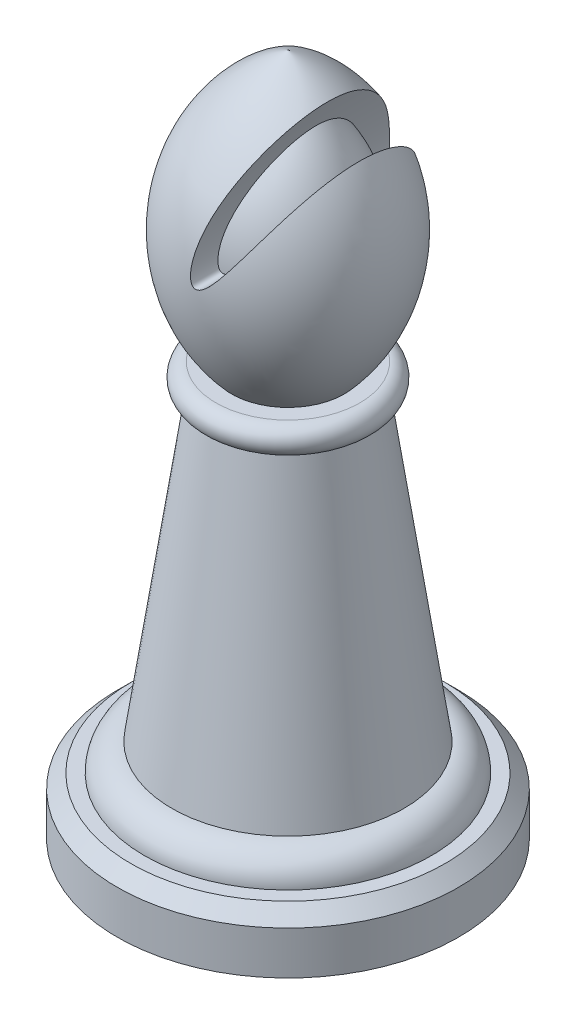
ISO-10303-21;
HEADER;
FILE_DESCRIPTION(('STEP AP214'),'2;1');
FILE_NAME('part.step','',(''),(''),'','','');
FILE_SCHEMA(('AUTOMOTIVE_DESIGN { 1 0 10303 214 1 1 1 1 }'));
ENDSEC;
DATA;
#1=APPLICATION_CONTEXT('core data for automotive mechanical design processes');
#2=APPLICATION_PROTOCOL_DEFINITION('international standard','automotive_design',2000,#1);
#3=PRODUCT_CONTEXT('',#1,'mechanical');
#4=PRODUCT('Part','Part','',(#3));
#5=PRODUCT_RELATED_PRODUCT_CATEGORY('part','',(#4));
#6=PRODUCT_DEFINITION_FORMATION('','',#4);
#7=PRODUCT_DEFINITION_CONTEXT('part definition',#1,'design');
#8=PRODUCT_DEFINITION('design','',#6,#7);
#9=PRODUCT_DEFINITION_SHAPE('','',#8);
#10=(LENGTH_UNIT() NAMED_UNIT(*) SI_UNIT(.MILLI.,.METRE.));
#11=(NAMED_UNIT(*) PLANE_ANGLE_UNIT() SI_UNIT($,.RADIAN.));
#12=(NAMED_UNIT(*) SI_UNIT($,.STERADIAN.) SOLID_ANGLE_UNIT());
#13=UNCERTAINTY_MEASURE_WITH_UNIT(LENGTH_MEASURE(1.E-05),#10,'distance_accuracy_value','');
#14=(GEOMETRIC_REPRESENTATION_CONTEXT(3) GLOBAL_UNCERTAINTY_ASSIGNED_CONTEXT((#13)) GLOBAL_UNIT_ASSIGNED_CONTEXT((#10,
#11,#12)) REPRESENTATION_CONTEXT('',''));
#15=CARTESIAN_POINT('',(0.,0.,0.));
#16=DIRECTION('',(0.,0.,1.));
#17=DIRECTION('',(1.,0.,0.));
#18=AXIS2_PLACEMENT_3D('',#15,#16,#17);
#19=CARTESIAN_POINT('',(0.,0.,0.));
#20=DIRECTION('',(0.,1.,0.));
#21=DIRECTION('',(0.,0.,1.));
#22=AXIS2_PLACEMENT_3D('',#19,#20,#21);
#23=PLANE('',#22);
#24=CARTESIAN_POINT('',(0.,0.,0.));
#25=DIRECTION('',(0.,-1.,0.));
#26=DIRECTION('',(0.,0.,-1.));
#27=AXIS2_PLACEMENT_3D('',#24,#25,#26);
#28=CIRCLE('',#27,9.525);
#29=CARTESIAN_POINT('',(0.,0.,-9.525));
#30=VERTEX_POINT('',#29);
#31=EDGE_CURVE('E117',#30,#30,#28,.T.);
#32=ORIENTED_EDGE('',*,*,#31,.T.);
#33=EDGE_LOOP('',(#32));
#34=FACE_BOUND('',#33,.T.);
#35=ADVANCED_FACE('F38',(#34),#23,.F.);
#36=CARTESIAN_POINT('',(0.,0.,0.));
#37=DIRECTION('',(0.,-1.,0.));
#38=DIRECTION('',(0.,0.,-1.));
#39=AXIS2_PLACEMENT_3D('',#36,#37,#38);
#40=CYLINDRICAL_SURFACE('',#39,9.525);
#41=CARTESIAN_POINT('',(0.,2.41300000000001,0.));
#42=DIRECTION('',(0.,-1.,0.));
#43=DIRECTION('',(0.,0.,-1.));
#44=AXIS2_PLACEMENT_3D('',#41,#42,#43);
#45=CIRCLE('',#44,9.525);
#46=CARTESIAN_POINT('',(0.,2.41300000000001,-9.525));
#47=VERTEX_POINT('',#46);
#48=EDGE_CURVE('E52',#47,#47,#45,.T.);
#49=ORIENTED_EDGE('',*,*,#48,.T.);
#50=EDGE_LOOP('',(#49));
#51=FACE_BOUND('',#50,.T.);
#52=ORIENTED_EDGE('',*,*,#31,.F.);
#53=EDGE_LOOP('',(#52));
#54=FACE_BOUND('',#53,.T.);
#55=ADVANCED_FACE('F74',(#51,#54),#40,.T.);
#56=CARTESIAN_POINT('',(-9.525,3.175,0.));
#57=DIRECTION('',(0.,-1.,0.));
#58=DIRECTION('',(0.,0.,-1.));
#59=AXIS2_PLACEMENT_3D('',#56,#57,#58);
#60=PLANE('',#59);
#61=CARTESIAN_POINT('',(0.,3.175,0.));
#62=DIRECTION('',(0.,-1.,0.));
#63=DIRECTION('',(0.,0.,-1.));
#64=AXIS2_PLACEMENT_3D('',#61,#62,#63);
#65=CIRCLE('',#64,8.76300000000001);
#66=CARTESIAN_POINT('',(0.,3.175,-8.76300000000001));
#67=VERTEX_POINT('',#66);
#68=EDGE_CURVE('E11',#67,#67,#65,.F.);
#69=ORIENTED_EDGE('',*,*,#68,.T.);
#70=EDGE_LOOP('',(#69));
#71=FACE_BOUND('',#70,.T.);
#72=CARTESIAN_POINT('',(0.,3.175,0.));
#73=DIRECTION('',(0.,-1.,0.));
#74=DIRECTION('',(0.,0.,-1.));
#75=AXIS2_PLACEMENT_3D('',#72,#73,#74);
#76=CIRCLE('',#75,8.001);
#77=CARTESIAN_POINT('',(0.,3.175,-8.001));
#78=VERTEX_POINT('',#77);
#79=EDGE_CURVE('E114',#78,#78,#76,.T.);
#80=ORIENTED_EDGE('',*,*,#79,.T.);
#81=EDGE_LOOP('',(#80));
#82=FACE_BOUND('',#81,.T.);
#83=ADVANCED_FACE('F80',(#71,#82),#60,.F.);
#84=CARTESIAN_POINT('',(0.,21.5392,0.));
#85=DIRECTION('',(0.,-1.,0.));
#86=DIRECTION('',(0.,0.,-1.));
#87=AXIS2_PLACEMENT_3D('',#84,#85,#86);
#88=CONICAL_SURFACE('',#87,4.0386,0.143796988986842);
#89=CARTESIAN_POINT('',(0.,4.699,0.));
#90=DIRECTION('',(0.,-1.,0.));
#91=DIRECTION('',(0.,0.,-1.));
#92=AXIS2_PLACEMENT_3D('',#89,#90,#91);
#93=CIRCLE('',#92,6.477);
#94=CARTESIAN_POINT('',(0.,4.699,-6.477));
#95=VERTEX_POINT('',#94);
#96=EDGE_CURVE('E105',#95,#95,#93,.T.);
#97=ORIENTED_EDGE('',*,*,#96,.F.);
#98=EDGE_LOOP('',(#97));
#99=FACE_BOUND('',#98,.T.);
#100=CARTESIAN_POINT('',(0.,21.5392,0.));
#101=DIRECTION('',(0.,-1.,0.));
#102=DIRECTION('',(0.,0.,-1.));
#103=AXIS2_PLACEMENT_3D('',#100,#101,#102);
#104=CIRCLE('',#103,4.0386);
#105=CARTESIAN_POINT('',(0.,21.5392,-4.0386));
#106=VERTEX_POINT('',#105);
#107=EDGE_CURVE('E99',#106,#106,#104,.T.);
#108=ORIENTED_EDGE('',*,*,#107,.T.);
#109=EDGE_LOOP('',(#108));
#110=FACE_BOUND('',#109,.T.);
#111=ADVANCED_FACE('F87',(#99,#110),#88,.T.);
#112=CARTESIAN_POINT('',(0.,22.3009847303013,0.));
#113=DIRECTION('',(0.,-1.,0.));
#114=DIRECTION('',(0.,0.,-1.));
#115=AXIS2_PLACEMENT_3D('',#112,#113,#114);
#116=TOROIDAL_SURFACE('',#115,4.01298473030127,0.762215269698735);
#117=ORIENTED_EDGE('',*,*,#107,.F.);
#118=EDGE_LOOP('',(#117));
#119=FACE_BOUND('',#118,.T.);
#120=CARTESIAN_POINT('',(0.,23.0632,0.));
#121=DIRECTION('',(0.,-1.,0.));
#122=DIRECTION('',(0.,0.,-1.));
#123=AXIS2_PLACEMENT_3D('',#120,#121,#122);
#124=CIRCLE('',#123,4.01298473030127);
#125=CARTESIAN_POINT('',(0.,23.0632,-4.01298473030127));
#126=VERTEX_POINT('',#125);
#127=EDGE_CURVE('E102',#126,#126,#124,.T.);
#128=ORIENTED_EDGE('',*,*,#127,.T.);
#129=EDGE_LOOP('',(#128));
#130=FACE_BOUND('',#129,.T.);
#131=ADVANCED_FACE('F67',(#119,#130),#116,.T.);
#132=CARTESIAN_POINT('',(-4.01298473030127,23.0632,0.));
#133=DIRECTION('',(0.,-1.,0.));
#134=DIRECTION('',(0.,0.,-1.));
#135=AXIS2_PLACEMENT_3D('',#132,#133,#134);
#136=PLANE('',#135);
#137=ORIENTED_EDGE('',*,*,#127,.F.);
#138=EDGE_LOOP('',(#137));
#139=FACE_BOUND('',#138,.T.);
#140=CARTESIAN_POINT('',(0.,23.0632,0.));
#141=DIRECTION('',(0.,-1.,0.));
#142=DIRECTION('',(0.,0.,-1.));
#143=AXIS2_PLACEMENT_3D('',#140,#141,#142);
#144=CIRCLE('',#143,3.1496);
#145=CARTESIAN_POINT('',(0.,23.0632,-3.1496));
#146=VERTEX_POINT('',#145);
#147=EDGE_CURVE('E103',#146,#146,#144,.T.);
#148=ORIENTED_EDGE('',*,*,#147,.T.);
#149=EDGE_LOOP('',(#148));
#150=FACE_BOUND('',#149,.T.);
#151=ADVANCED_FACE('F59',(#139,#150),#136,.F.);
#152=CARTESIAN_POINT('',(0.,29.4269833142424,3.93756353200422));
#153=DIRECTION('',(-1.,0.,0.));
#154=DIRECTION('',(0.,0.,-1.));
#155=AXIS2_PLACEMENT_3D('',#152,#153,#154);
#156=CIRCLE('',#155,9.525);
#157=TRIMMED_CURVE('',#156,(PARAMETER_VALUE(-1.14461964713462)),
(PARAMETER_VALUE(1.14461964713462)),.T.,.PARAMETER.);
#158=CARTESIAN_POINT('',(0.,29.4269833142424,0.));
#159=DIRECTION('',(0.,-1.,0.));
#160=AXIS1_PLACEMENT('',#158,#159);
#161=SURFACE_OF_REVOLUTION('',#157,#160);
#162=CARTESIAN_POINT('',(2.03751253474216,36.3358345694183,-1.64610165316395));
#163=CARTESIAN_POINT('',(2.00906874216212,36.2724669868264,-1.78755946603824));
#164=CARTESIAN_POINT('',(1.97787373336976,36.202509543688,-1.92549861286107));
#165=CARTESIAN_POINT('',(1.91113638296994,36.0514319904695,-2.19411636212512));
#166=CARTESIAN_POINT('',(1.87559003994477,35.9703015972226,-2.32478811857831));
#167=CARTESIAN_POINT('',(1.80098956697505,35.7982142667814,-2.57908702638597));
#168=CARTESIAN_POINT('',(1.76192389734931,35.7072247887049,-2.70268865691573));
#169=CARTESIAN_POINT('',(1.68118236475959,35.5169169194525,-2.94227189667885));
#170=CARTESIAN_POINT('',(1.63950754276453,35.4176018446313,-3.05825650749328));
#171=CARTESIAN_POINT('',(1.53989710806596,35.1770746953728,-3.32019595582764));
#172=CARTESIAN_POINT('',(1.48118516115996,35.0329602392859,-3.46319872137387));
#173=CARTESIAN_POINT('',(1.36167198295966,34.7335914274955,-3.73532350473355));
#174=CARTESIAN_POINT('',(1.30087499760153,34.5783590829596,-3.86447175048659));
#175=CARTESIAN_POINT('',(1.17825572472166,34.2578685334228,-4.10908153368953));
#176=CARTESIAN_POINT('',(1.11643347629379,34.0926107100634,-4.22454359164014));
#177=CARTESIAN_POINT('',(0.99289439648312,33.7531421377198,-4.44167362211386));
#178=CARTESIAN_POINT('',(0.931177617491817,33.5789278150505,-4.54333602868468));
#179=CARTESIAN_POINT('',(0.80915399770765,33.2227044146293,-4.73260778940063));
#180=CARTESIAN_POINT('',(0.748846377876339,33.0406998091998,-4.82022507316772));
#181=CARTESIAN_POINT('',(0.63103209688285,32.6696058585737,-4.98137633742941));
#182=CARTESIAN_POINT('',(0.573526054324522,32.4805149648464,-5.05490721798343));
#183=CARTESIAN_POINT('',(0.488372013888106,32.1835420837679,-5.15753818181969));
#184=CARTESIAN_POINT('',(0.459039925963291,32.0778409446375,-5.19163541671276));
#185=CARTESIAN_POINT('',(0.402231547090903,31.8646796648828,-5.25560408657752));
#186=CARTESIAN_POINT('',(0.374755057650493,31.7572197139306,-5.28547597390876));
#187=CARTESIAN_POINT('',(0.322236616122614,31.5406835826812,-5.34097791428228));
#188=CARTESIAN_POINT('',(0.297193421131726,31.4316082606627,-5.36661013765349));
#189=CARTESIAN_POINT('',(0.250322266025499,31.2118481461023,-5.41365468239726));
#190=CARTESIAN_POINT('',(0.228494435874794,31.1011632887016,-5.43506683320683));
#191=CARTESIAN_POINT('',(0.194516559860897,30.9077486851492,-5.46856093813584));
#192=CARTESIAN_POINT('',(0.181333812437436,30.8253682202507,-5.48161273847806));
#193=CARTESIAN_POINT('',(0.158219282315515,30.6598405539964,-5.50542199788717));
#194=CARTESIAN_POINT('',(0.14828612892423,30.5766936911667,-5.51618042364052));
#195=CARTESIAN_POINT('',(0.134546786373008,30.4262754321813,-5.53347977772276));
#196=CARTESIAN_POINT('',(0.129915702019265,30.3591295682312,-5.5404339710962));
#197=CARTESIAN_POINT('',(0.124834993101103,30.2243543336518,-5.55284182573528));
#198=CARTESIAN_POINT('',(0.124394793053888,30.1567242153698,-5.55829207822706));
#199=CARTESIAN_POINT('',(0.129411365137497,30.0369864661999,-5.56652335737356));
#200=CARTESIAN_POINT('',(0.133542744468013,29.9848655502428,-5.56962976082315));
#201=CARTESIAN_POINT('',(0.144343058494324,29.9073782827253,-5.57348163387992));
#202=CARTESIAN_POINT('',(0.148696831063322,29.8817165277057,-5.57462944518202));
#203=CARTESIAN_POINT('',(0.159419118097114,29.8308071932523,-5.57663076622413));
#204=CARTESIAN_POINT('',(0.165785711621921,29.8055592429685,-5.57748455494876));
#205=CARTESIAN_POINT('',(0.178827610902525,29.7636325189841,-5.57863776209677));
#206=CARTESIAN_POINT('',(0.184787546911461,29.7467367273522,-5.5790270292978));
#207=CARTESIAN_POINT('',(0.198335861431476,29.713559375165,-5.57961905332264));
#208=CARTESIAN_POINT('',(0.205926749302794,29.6972788070916,-5.57982152016761));
#209=CARTESIAN_POINT('',(0.223240278315006,29.6655921547905,-5.58000366723806));
#210=CARTESIAN_POINT('',(0.232988815121363,29.650199833457,-5.57998047992333));
#211=CARTESIAN_POINT('',(0.254963868712705,29.6213394317874,-5.57965262574113));
#212=CARTESIAN_POINT('',(0.267177912690378,29.6078622256749,-5.57934934925764));
#213=CARTESIAN_POINT('',(0.290161402665275,29.5874898260034,-5.57855460836333));
#214=CARTESIAN_POINT('',(0.300256945758582,29.5798350463893,-5.57814739879202));
#215=CARTESIAN_POINT('',(0.321593299193536,29.5663519274109,-5.57716512347615));
#216=CARTESIAN_POINT('',(0.332833024518747,29.560521878665,-5.57659021581029));
#217=CARTESIAN_POINT('',(0.356151609745053,29.5509132589634,-5.57527959735004));
#218=CARTESIAN_POINT('',(0.368230770933557,29.5471354289172,-5.57454382861449));
#219=CARTESIAN_POINT('',(0.392835520524883,29.5416150153852,-5.57293249030028));
#220=CARTESIAN_POINT('',(0.405361592483361,29.5398747098251,-5.57205676549279));
#221=CARTESIAN_POINT('',(0.452869311133617,29.536749452509,-5.56852808067531));
#222=CARTESIAN_POINT('',(0.488221574586673,29.5414851501309,-5.56548100455043));
#223=CARTESIAN_POINT('',(0.537718072843107,29.5541498770716,-5.56067298388129));
#224=CARTESIAN_POINT('',(0.552992841052662,29.5589671817181,-5.5591076002091));
#225=CARTESIAN_POINT('',(0.58307317692713,29.5698787330364,-5.55587406966752));
#226=CARTESIAN_POINT('',(0.597879435832461,29.5759709868004,-5.55420608601469));
#227=CARTESIAN_POINT('',(0.62707170667307,29.5891624209127,-5.55076957282137));
#228=CARTESIAN_POINT('',(0.641456026306219,29.5962651244168,-5.54900070503166));
#229=CARTESIAN_POINT('',(0.669802748485842,29.6112544755409,-5.54537013099445));
#230=CARTESIAN_POINT('',(0.683765018477151,29.619141366186,-5.54350839605642));
#231=CARTESIAN_POINT('',(0.719921977359869,29.6406732315002,-5.53850069489189));
#232=CARTESIAN_POINT('',(0.741799231541759,29.6548323282114,-5.53528030692353));
#233=CARTESIAN_POINT('',(0.784693540730599,29.6843541438182,-5.52860286643637));
#234=CARTESIAN_POINT('',(0.805710105585212,29.6997175344232,-5.52514568197913));
#235=CARTESIAN_POINT('',(0.86772557218741,29.747204689802,-5.51440933191429));
#236=CARTESIAN_POINT('',(0.907623766920381,29.7806833134667,-5.506774697197));
#237=CARTESIAN_POINT('',(0.985347920607562,29.8499805720281,-5.4905282013145));
#238=CARTESIAN_POINT('',(1.02316557452937,29.8858074874523,-5.48191279335828));
#239=CARTESIAN_POINT('',(1.0970085444064,29.9589495346044,-5.46372877041914));
#240=CARTESIAN_POINT('',(1.13303561512387,29.9962631420692,-5.45416111739542));
#241=CARTESIAN_POINT('',(1.20862436838644,30.077292443884,-5.43264603359731));
#242=CARTESIAN_POINT('',(1.2479700243997,30.1211701484556,-5.42055318052269));
#243=CARTESIAN_POINT('',(1.32512186008237,30.209916462521,-5.39510370750801));
#244=CARTESIAN_POINT('',(1.36292759221256,30.2547853543163,-5.38174672387679));
#245=CARTESIAN_POINT('',(1.47413951641513,30.3901426273798,-5.33986429699851));
#246=CARTESIAN_POINT('',(1.54559346284432,30.4816604782498,-5.30945446393674));
#247=CARTESIAN_POINT('',(1.67263721309074,30.6503950282844,-5.2491676659642));
#248=CARTESIAN_POINT('',(1.72886716593344,30.7274145902752,-5.22006929318517));
#249=CARTESIAN_POINT('',(1.8388444709275,30.8818441172834,-5.15839378460243));
#250=CARTESIAN_POINT('',(1.89259148813988,30.9592541334186,-5.12581618141486));
#251=CARTESIAN_POINT('',(2.05059498941767,31.1915843543026,-5.02280700732011));
#252=CARTESIAN_POINT('',(2.15152556292168,31.346484844209,-4.94714142151659));
#253=CARTESIAN_POINT('',(2.34546174421918,31.6535060666006,-4.78207189154323));
#254=CARTESIAN_POINT('',(2.43847822025582,31.8056303782725,-4.69268727665737));
#255=CARTESIAN_POINT('',(2.61730682697022,32.1055446954426,-4.50009630110663));
#256=CARTESIAN_POINT('',(2.70311254251157,32.2533307668972,-4.39687784044103));
#257=CARTESIAN_POINT('',(2.86477417961348,32.5377016341604,-4.18050028578203));
#258=CARTESIAN_POINT('',(2.9408691280129,32.6744964116786,-4.06779818594273));
#259=CARTESIAN_POINT('',(3.08627444058627,32.9405165189049,-3.82981271710946));
#260=CARTESIAN_POINT('',(3.15558192033496,33.0697386212158,-3.70452404470792));
#261=CARTESIAN_POINT('',(3.35296448186768,33.4434138825469,-3.3098314671229));
#262=CARTESIAN_POINT('',(3.47071286762378,33.6742583205883,-3.02131699752943));
#263=CARTESIAN_POINT('',(3.60778640644759,33.9486511125258,-2.60076433678352));
#264=CARTESIAN_POINT('',(3.64141639339631,34.0165720486362,-2.48859985628932));
#265=CARTESIAN_POINT('',(3.70444981173112,34.1447735937449,-2.25879738093393));
#266=CARTESIAN_POINT('',(3.73385377830531,34.205055170086,-2.14116008165891));
#267=CARTESIAN_POINT('',(3.78811243063339,34.3169566336492,-1.90094598323914));
#268=CARTESIAN_POINT('',(3.81297097006242,34.368583855031,-1.77837347683617));
#269=CARTESIAN_POINT('',(3.85785639440485,34.4622548374407,-1.5288016526949));
#270=CARTESIAN_POINT('',(3.87788534762441,34.5043027004727,-1.40180425671252));
#271=CARTESIAN_POINT('',(3.912984357337,34.5782547703823,-1.14287488748179));
#272=CARTESIAN_POINT('',(3.92800555889161,34.6100589451649,-1.01090752665465));
#273=CARTESIAN_POINT('',(3.95254746067873,34.6621419916072,-0.744201230570568));
#274=CARTESIAN_POINT('',(3.96206824789241,34.68242104552,-0.609462339176304));
#275=CARTESIAN_POINT('',(3.97540559623197,34.7108559514746,-0.338510503642612));
#276=CARTESIAN_POINT('',(3.97922577888614,34.7190195003391,-0.202298550776993));
#277=CARTESIAN_POINT('',(3.98108637685281,34.7229934364882,0.0703371449589885));
#278=CARTESIAN_POINT('',(3.97912745143673,34.7188052328411,0.20676086189711));
#279=CARTESIAN_POINT('',(3.97012734454072,34.6996004689416,0.460189016613661));
#280=CARTESIAN_POINT('',(3.96380465197634,34.6861149971228,0.577338984305888));
#281=CARTESIAN_POINT('',(3.94696709270968,34.6502948438092,0.810008491512965));
#282=CARTESIAN_POINT('',(3.93645085498754,34.6279572682599,0.925527485002574));
#283=CARTESIAN_POINT('',(3.91138265132166,34.5748969870152,1.15415116338496));
#284=CARTESIAN_POINT('',(3.89683133612892,34.5441756334134,1.26725623441443));
#285=CARTESIAN_POINT('',(3.86388266618599,34.4749206343931,1.49049168331571));
#286=CARTESIAN_POINT('',(3.84548376799564,34.43638385404,1.60062084733544));
#287=CARTESIAN_POINT('',(3.78338632830993,34.3070013398909,1.93343352216416));
#288=CARTESIAN_POINT('',(3.73367702553476,34.2042949820225,2.15050741453612));
#289=CARTESIAN_POINT('',(3.62040302263181,33.9737619160285,2.56682672154575));
#290=CARTESIAN_POINT('',(3.55682605171735,33.8459129704422,2.76605612486638));
#291=CARTESIAN_POINT('',(3.38269806054699,33.5019986556062,3.23908041906232));
#292=CARTESIAN_POINT('',(3.2644555615483,33.2735508277523,3.50110207657919));
#293=CARTESIAN_POINT('',(3.0031934415131,32.7858992210012,3.97996191574875));
#294=CARTESIAN_POINT('',(2.86016192285548,32.5266806924531,4.19677829029683));
#295=CARTESIAN_POINT('',(2.62752894756475,32.1233462722778,4.48759013050317));
#296=CARTESIAN_POINT('',(2.54682465430558,31.986249450153,4.57891200578999));
#297=CARTESIAN_POINT('',(2.37928412916323,31.7088190503039,4.74980872767529));
#298=CARTESIAN_POINT('',(2.29245713184023,31.568490553279,4.82940072834711));
#299=CARTESIAN_POINT('',(2.1283981518645,31.3114724665384,4.96360933967825));
#300=CARTESIAN_POINT('',(2.05225589683504,31.1950790287635,5.02014212067764));
#301=CARTESIAN_POINT('',(1.89491671715081,30.9619423361042,5.12540089273842));
#302=CARTESIAN_POINT('',(1.81371464849186,30.8451988439764,5.17411875294276));
#303=CARTESIAN_POINT('',(1.68744590690263,30.6708892097834,5.2413060506112));
#304=CARTESIAN_POINT('',(1.64456681740678,30.6128624966223,5.26273875755938));
#305=CARTESIAN_POINT('',(1.55715271279313,30.4973631452975,5.30362125997804));
#306=CARTESIAN_POINT('',(1.51261786089197,30.4398904532207,5.32307125019111));
#307=CARTESIAN_POINT('',(1.42174340667474,30.3259513125341,5.35994922986077));
#308=CARTESIAN_POINT('',(1.3754081056788,30.2694828851786,5.37738168498902));
#309=CARTESIAN_POINT('',(1.28048336790634,30.1578945084562,5.41027602322892));
#310=CARTESIAN_POINT('',(1.23189454292884,30.1027741992299,5.42573843695598));
#311=CARTESIAN_POINT('',(1.13891138798041,30.0022202249951,5.45266992242807));
#312=CARTESIAN_POINT('',(1.09488703560737,29.9565137663127,5.4643948212823));
#313=CARTESIAN_POINT('',(1.0039615084058,29.8672126916243,5.48645932253828));
#314=CARTESIAN_POINT('',(0.957048322996464,29.8236284601178,5.4967924798845));
#315=CARTESIAN_POINT('',(0.883650669087959,29.760941595472,5.51126932869403));
#316=CARTESIAN_POINT('',(0.858520856678344,29.7403796950123,5.51594927394607));
#317=CARTESIAN_POINT('',(0.807135622657627,29.7006363907474,5.524940484158));
#318=CARTESIAN_POINT('',(0.78088077449662,29.6814542966789,5.52925193366797));
#319=CARTESIAN_POINT('',(0.72714403184911,29.6451357593793,5.537483281952));
#320=CARTESIAN_POINT('',(0.699670034582788,29.627988219328,5.54140528369971));
#321=CARTESIAN_POINT('',(0.64308646019626,29.5965966881511,5.54887065255989));
#322=CARTESIAN_POINT('',(0.613981561547172,29.5823448846398,5.55241502583035));
#323=CARTESIAN_POINT('',(0.565488442324667,29.5631566097665,5.55780234265689));
#324=CARTESIAN_POINT('',(0.546705626519788,29.5567504897189,5.55977235314346));
#325=CARTESIAN_POINT('',(0.508433828477369,29.5464323527075,5.56353801417621));
#326=CARTESIAN_POINT('',(0.488945975181331,29.5425165200589,5.56533392788165));
#327=CARTESIAN_POINT('',(0.454957565677116,29.5387823624529,5.56824347138564));
#328=CARTESIAN_POINT('',(0.440558263228815,29.5381337000872,5.56940896701225));
#329=CARTESIAN_POINT('',(0.41182223350143,29.5391335766904,5.5715956204965));
#330=CARTESIAN_POINT('',(0.397485448934824,29.5407791051563,5.572616965577));
#331=CARTESIAN_POINT('',(0.36918148393169,29.5467519083602,5.57449059721724));
#332=CARTESIAN_POINT('',(0.355220151890828,29.551108668294,5.57534088714463));
#333=CARTESIAN_POINT('',(0.328455117073827,29.5625553191642,5.57682536668009));
#334=CARTESIAN_POINT('',(0.315651019555028,29.5696442737487,5.57745963018258));
#335=CARTESIAN_POINT('',(0.29344395206225,29.5849055418119,5.57842646386938));
#336=CARTESIAN_POINT('',(0.283818518443403,29.592758740845,5.5787899160696));
#337=CARTESIAN_POINT('',(0.265795219400724,29.6097808526521,5.5793658205577));
#338=CARTESIAN_POINT('',(0.257399366214209,29.618951874546,5.57957802747549));
#339=CARTESIAN_POINT('',(0.236510212795953,29.6447880334474,5.57996498329258));
#340=CARTESIAN_POINT('',(0.225094845144899,29.6623207389212,5.58001694098044));
#341=CARTESIAN_POINT('',(0.204984770828519,29.6988857845844,5.57981755268177));
#342=CARTESIAN_POINT('',(0.196300173646454,29.7179233780616,5.57956509602168));
#343=CARTESIAN_POINT('',(0.179223659968338,29.7614505517883,5.57872259191595));
#344=CARTESIAN_POINT('',(0.1713974866389,29.7861559406247,5.57806629453869));
#345=CARTESIAN_POINT('',(0.158104166780317,29.8361955710474,5.57643822554247));
#346=CARTESIAN_POINT('',(0.152641190879841,29.8615308416379,5.57546590144362));
#347=CARTESIAN_POINT('',(0.143483648546244,29.9125953740469,5.5732390797487));
#348=CARTESIAN_POINT('',(0.139795773700856,29.9383257551623,5.57198354022331));
#349=CARTESIAN_POINT('',(0.133817469765142,29.989937874237,5.56921428139707));
#350=CARTESIAN_POINT('',(0.131527616741513,30.0158196701592,5.56770045599563));
#351=CARTESIAN_POINT('',(0.126881064135389,30.0852538503676,5.56331692396854));
#352=CARTESIAN_POINT('',(0.125536989768534,30.1288587892885,5.56022503869024));
#353=CARTESIAN_POINT('',(0.125112732421055,30.216036172385,5.5533891661064));
#354=CARTESIAN_POINT('',(0.126033859564321,30.2596085831689,5.54964480259087));
#355=CARTESIAN_POINT('',(0.129606978992592,30.3465015964668,5.5415336388341));
#356=CARTESIAN_POINT('',(0.132254286063981,30.389822561269,5.53716854837984));
#357=CARTESIAN_POINT('',(0.138921610909412,30.4762936105095,5.52781760540699));
#358=CARTESIAN_POINT('',(0.142941829318865,30.5194436690388,5.52283166222554));
#359=CARTESIAN_POINT('',(0.156512215461624,30.6470985107798,5.50713567333488));
#360=CARTESIAN_POINT('',(0.167655005527275,30.73132723317,5.49554499261083));
#361=CARTESIAN_POINT('',(0.193000753612632,30.8989714794248,5.47000252295716));
#362=CARTESIAN_POINT('',(0.207204716788432,30.9823867267534,5.45604995881137));
#363=CARTESIAN_POINT('',(0.237950938967432,31.1484341940317,5.42577401583566));
#364=CARTESIAN_POINT('',(0.254495413085226,31.2310655921531,5.40944839067779));
#365=CARTESIAN_POINT('',(0.289412423067647,31.3954391819667,5.37443625627713));
#366=CARTESIAN_POINT('',(0.307785142485005,31.4771812834592,5.35574950993088));
#367=CARTESIAN_POINT('',(0.36497788840992,31.7205634082461,5.29625932497157));
#368=CARTESIAN_POINT('',(0.405968046211572,31.8808496897911,5.25193655317531));
#369=CARTESIAN_POINT('',(0.491779373061911,32.1973731172203,5.1539343644549));
#370=CARTESIAN_POINT('',(0.536598796351572,32.3536120663876,5.10025919980053));
#371=CARTESIAN_POINT('',(0.62885096214445,32.6617844335007,4.98356029939328));
#372=CARTESIAN_POINT('',(0.676283876515106,32.8137175672918,4.92053594836032));
#373=CARTESIAN_POINT('',(0.772807830358654,33.1128128045685,4.78520894466165));
#374=CARTESIAN_POINT('',(0.821898626480564,33.2599756021029,4.7129076493817));
#375=CARTESIAN_POINT('',(0.934661492177819,33.5890123226577,4.5378431644662));
#376=CARTESIAN_POINT('',(0.998618551913547,33.7692566116552,4.4321800405989));
#377=CARTESIAN_POINT('',(1.1267285137501,34.1204635844976,4.20580561740795));
#378=CARTESIAN_POINT('',(1.19088156200422,34.2914092376655,4.08506795830558));
#379=CARTESIAN_POINT('',(1.31474579743601,34.6139606877027,3.83538497693714));
#380=CARTESIAN_POINT('',(1.37451690752377,34.7661079578595,3.70716983504352));
#381=CARTESIAN_POINT('',(1.49187774658544,35.0593264870108,3.43751343359794));
#382=CARTESIAN_POINT('',(1.54946622838917,35.2003914614498,3.29606476775946));
#383=CARTESIAN_POINT('',(1.66111921610613,35.4695422909417,3.00022512238107));
#384=CARTESIAN_POINT('',(1.71518655682924,35.5976386340739,2.84584478870262));
#385=CARTESIAN_POINT('',(1.81831255957922,35.8386592453645,2.52417958377259));
#386=CARTESIAN_POINT('',(1.86737570294566,35.9515971173344,2.35690649815353));
#387=CARTESIAN_POINT('',(1.93785828474989,36.1120395141384,2.08843329282308));
#388=CARTESIAN_POINT('',(1.96172034524367,36.1659836257328,1.9916879187296));
#389=CARTESIAN_POINT('',(2.00698002707742,36.2677354344613,1.79441456796644));
#390=CARTESIAN_POINT('',(2.02837722319078,36.3155420729503,1.69388594258514));
#391=CARTESIAN_POINT('',(2.06820331367478,36.4041045810344,1.48941785665717));
#392=CARTESIAN_POINT('',(2.08663777682188,36.4448736893721,1.38548524781339));
#393=CARTESIAN_POINT('',(2.12006603183967,36.5185227981356,1.17436206656381));
#394=CARTESIAN_POINT('',(2.13506186413209,36.5514074775707,1.06717346919237));
#395=CARTESIAN_POINT('',(2.1591620109277,36.6041105134626,0.866094326045889));
#396=CARTESIAN_POINT('',(2.16881013190997,36.6251431380429,0.772587736625073));
#397=CARTESIAN_POINT('',(2.18492523628696,36.6602168569826,0.584033816945022));
#398=CARTESIAN_POINT('',(2.19139376188705,36.6742613408541,0.488987256775075));
#399=CARTESIAN_POINT('',(2.20091890681708,36.6949266114257,0.297941077459961));
#400=CARTESIAN_POINT('',(2.20397651989713,36.7015495603505,0.20194174412764));
#401=CARTESIAN_POINT('',(2.20656161500277,36.7071496699638,0.00967081416808514));
#402=CARTESIAN_POINT('',(2.2060891233565,36.7061268876755,-0.0866007804232216));
#403=CARTESIAN_POINT('',(2.2016336477839,36.6964727316875,-0.278660802512562));
#404=CARTESIAN_POINT('',(2.19765120244273,36.6878425253097,-0.374449301871347));
#405=CARTESIAN_POINT('',(2.18633186777548,36.6632678468258,-0.564881033198337));
#406=CARTESIAN_POINT('',(2.17899468582062,36.6473227366509,-0.659524164518365));
#407=CARTESIAN_POINT('',(2.16122578292204,36.6086064584824,-0.847075996287194));
#408=CARTESIAN_POINT('',(2.15079466746129,36.5858366260782,-0.939985032320603));
#409=CARTESIAN_POINT('',(2.12714930648412,36.5340498375998,-1.12369129737492));
#410=CARTESIAN_POINT('',(2.11393437631339,36.5050313446845,-1.2144880007752));
#411=CARTESIAN_POINT('',(2.08077943787087,36.4319372533036,-1.42016760569925));
#412=CARTESIAN_POINT('',(2.06000627254844,36.3859465150819,-1.53423489191931));
#413=CARTESIAN_POINT('',(2.03751253474216,36.3358345694183,-1.64610165316395));
#414=B_SPLINE_CURVE_WITH_KNOTS('',3,(#162,#163,#164,#165,#166,#167,#168,#169,#170,#171,#172,
#173,#174,#175,#176,#177,#178,#179,#180,#181,#182,#183,#184,#185,#186,#187,#188,#189,#190,#191,
#192,#193,#194,#195,#196,#197,#198,#199,#200,#201,#202,#203,#204,#205,#206,#207,#208,#209,#210,
#211,#212,#213,#214,#215,#216,#217,#218,#219,#220,#221,#222,#223,#224,#225,#226,#227,#228,#229,
#230,#231,#232,#233,#234,#235,#236,#237,#238,#239,#240,#241,#242,#243,#244,#245,#246,#247,#248,
#249,#250,#251,#252,#253,#254,#255,#256,#257,#258,#259,#260,#261,#262,#263,#264,#265,#266,#267,
#268,#269,#270,#271,#272,#273,#274,#275,#276,#277,#278,#279,#280,#281,#282,#283,#284,#285,#286,
#287,#288,#289,#290,#291,#292,#293,#294,#295,#296,#297,#298,#299,#300,#301,#302,#303,#304,#305,
#306,#307,#308,#309,#310,#311,#312,#313,#314,#315,#316,#317,#318,#319,#320,#321,#322,#323,#324,
#325,#326,#327,#328,#329,#330,#331,#332,#333,#334,#335,#336,#337,#338,#339,#340,#341,#342,#343,
#344,#345,#346,#347,#348,#349,#350,#351,#352,#353,#354,#355,#356,#357,#358,#359,#360,#361,#362,
#363,#364,#365,#366,#367,#368,#369,#370,#371,#372,#373,#374,#375,#376,#377,#378,#379,#380,#381,
#382,#383,#384,#385,#386,#387,#388,#389,#390,#391,#392,#393,#394,#395,#396,#397,#398,#399,#400,
#401,#402,#403,#404,#405,#406,#407,#408,#409,#410,#411,#412,#413),.UNSPECIFIED.,.T.,.F.,(4,2,2,
2,2,2,2,2,2,2,2,2,2,2,2,2,2,2,2,2,2,2,2,2,2,2,2,2,2,2,2,2,2,2,2,2,2,2,2,2,2,2,2,2,2,2,2,2,2,2,2,
2,2,2,2,2,2,2,2,2,2,2,2,2,2,2,2,2,2,2,2,2,2,2,2,2,2,2,2,2,2,2,2,2,2,2,2,2,2,2,2,2,2,2,2,2,2,2,2,
2,2,2,2,2,2,2,2,2,2,2,2,2,2,2,2,2,2,2,2,2,2,2,2,2,2,4),(0.,0.472607715728156,0.945653345664695,
1.42031082467783,1.89478012255327,2.52795507363711,3.15990938570747,3.7918396561474,
4.42402405678889,5.05585027083333,5.68781536911781,6.03234517563293,6.37683806932678,
6.72115406397982,7.0654839720245,7.3187401062065,7.57188927770668,7.77477890127069,
7.97812467827823,8.13497315372959,8.2130793491869,8.29111122770439,8.34480988733254,
8.39859176631166,8.45305797154914,8.50725524730631,8.54511968935859,8.5829485536397,
8.62079106615637,8.65867584582681,8.76384579652455,8.81214304041351,8.86036534603716,
8.90876010927549,8.95716991740932,9.03588138846929,9.11463707852695,9.27238521409682,
9.43072311413101,9.58890265395045,9.76934133328709,9.94983208367514,10.3096652715961,
10.6086825300984,10.9077400078545,11.5063180053202,12.1040602558512,12.7023287856992,
13.2802670490053,13.8584498587186,15.0132682139064,15.4191170292426,15.8249144020429,
16.2303661227589,16.6356438961435,17.0447670875209,17.453883809024,17.8627405125799,
18.2715505762191,18.6254130012742,18.9793912115833,19.3333123677602,19.6873757710562,
20.4201601265102,21.1535955346906,22.2492846684275,23.3455011477092,23.8953964037561,
24.4444793239716,24.8946352304256,25.3452564954796,25.5710202620505,25.7967618326769,
26.0219937767606,26.2471649275364,26.4406959946245,26.6350945488884,26.7334756975953,
26.8318072827452,26.9295751562174,27.0270756537969,27.0867921641717,27.1464169534544,
27.189655423712,27.23283720858,27.276497014431,27.3201418708909,27.35727938256,27.3944770073096,
27.456877064618,27.5195054827347,27.597098140698,27.6748271828934,27.752846988519,
27.8308989212046,27.9620070275011,28.0931909805844,28.2240203468291,28.3548688404883,
28.6119891169206,28.8691939494504,29.1266438557679,29.3841196357485,29.8975517011714,
30.4107509297588,30.9239839475387,31.4371419554413,32.0919275075803,32.7478745085142,
33.3704465448498,33.9933691188678,34.6157838255216,35.2376361634797,35.5773545232682,
35.9171314021512,36.2562619697263,36.5951907795555,36.8838808242063,37.1724307064523,
37.4608964993456,37.7493601408113,38.0377795266514,38.3262240756935,38.6146122133227,
38.9030713604134,39.2768159661264),.UNSPECIFIED.);
#415=CARTESIAN_POINT('',(2.03751253474216,36.3358345694183,-1.64610165316395));
#416=VERTEX_POINT('',#415);
#417=EDGE_CURVE('E108',#416,#416,#414,.T.);
#418=ORIENTED_EDGE('',*,*,#417,.T.);
#419=EDGE_LOOP('',(#418));
#420=FACE_BOUND('',#419,.T.);
#421=ORIENTED_EDGE('',*,*,#147,.F.);
#422=EDGE_LOOP('',(#421));
#423=FACE_BOUND('',#422,.T.);
#424=CARTESIAN_POINT('',(0.,38.1,0.));
#425=VERTEX_POINT('',#424);
#426=VERTEX_LOOP('',#425);
#427=FACE_BOUND('',#426,.T.);
#428=ADVANCED_FACE('F56',(#420,#423,#427),#161,.T.);
#429=CARTESIAN_POINT('',(0.,3.175,0.));
#430=DIRECTION('',(0.,-1.,0.));
#431=DIRECTION('',(0.,0.,-1.));
#432=AXIS2_PLACEMENT_3D('',#429,#430,#431);
#433=TOROIDAL_SURFACE('',#432,6.477,1.524);
#434=ORIENTED_EDGE('',*,*,#96,.T.);
#435=EDGE_LOOP('',(#434));
#436=FACE_BOUND('',#435,.T.);
#437=ORIENTED_EDGE('',*,*,#79,.F.);
#438=EDGE_LOOP('',(#437));
#439=FACE_BOUND('',#438,.T.);
#440=ADVANCED_FACE('F58',(#436,#439),#433,.T.);
#441=CARTESIAN_POINT('',(0.,2.41300000000001,0.));
#442=DIRECTION('',(0.,-1.,0.));
#443=DIRECTION('',(0.,0.,-1.));
#444=AXIS2_PLACEMENT_3D('',#441,#442,#443);
#445=CONICAL_SURFACE('',#444,9.525,0.785398163397451);
#446=ORIENTED_EDGE('',*,*,#68,.F.);
#447=EDGE_LOOP('',(#446));
#448=FACE_BOUND('',#447,.T.);
#449=ORIENTED_EDGE('',*,*,#48,.F.);
#450=EDGE_LOOP('',(#449));
#451=FACE_BOUND('',#450,.T.);
#452=ADVANCED_FACE('F41',(#448,#451),#445,.T.);
#453=CARTESIAN_POINT('',(3.13602731302638,35.8058497932573,-9.525));
#454=DIRECTION('',(0.,0.,1.));
#455=DIRECTION('',(0.408683074477861,0.912676363578746,0.));
#456=AXIS2_PLACEMENT_3D('',#453,#454,#455);
#457=ELLIPSE('',#456,6.8453,1.2192);
#458=DIRECTION('',(0.,0.,1.));
#459=VECTOR('',#458,1.);
#460=SURFACE_OF_LINEAR_EXTRUSION('',#457,#459);
#461=CARTESIAN_POINT('',(0.503165015988567,32.234835943669,-3.51877042288763));
#462=CARTESIAN_POINT('',(0.466583710898537,32.1058093192059,-3.57284918079183));
#463=CARTESIAN_POINT('',(0.430959502450186,31.9748298533173,-3.62286943585348));
#464=CARTESIAN_POINT('',(0.362623788603196,31.7093164783333,-3.71481576196016));
#465=CARTESIAN_POINT('',(0.329912128920495,31.5747827580047,-3.75674226188665));
#466=CARTESIAN_POINT('',(0.2693364345891,31.3049291500184,-3.83183683600027));
#467=CARTESIAN_POINT('',(0.24139558434146,31.1696672433432,-3.86514928766992));
#468=CARTESIAN_POINT('',(0.204255620955713,30.9646252599364,-3.90929380920612));
#469=CARTESIAN_POINT('',(0.192667442069962,30.8958938695719,-3.92304197202868));
#470=CARTESIAN_POINT('',(0.171539627943154,30.7577630849503,-3.94859115675457));
#471=CARTESIAN_POINT('',(0.161999555501376,30.6883638365695,-3.9603925940924));
#472=CARTESIAN_POINT('',(0.147723501201657,30.5668685773294,-3.97925898342915));
#473=CARTESIAN_POINT('',(0.142382993142878,30.5149117270427,-3.9867615694287));
#474=CARTESIAN_POINT('',(0.13359520059796,30.4106957518589,-4.00067968445535));
#475=CARTESIAN_POINT('',(0.130147600011417,30.3584366789043,-4.00709539485819));
#476=CARTESIAN_POINT('',(0.125740208436326,30.2536160408111,-4.01882866165932));
#477=CARTESIAN_POINT('',(0.124783372400895,30.2010541904556,-4.02414490681823));
#478=CARTESIAN_POINT('',(0.126337422749184,30.0959069851062,-4.03362141859232));
#479=CARTESIAN_POINT('',(0.12884471325602,30.0433217110436,-4.03778287853029));
#480=CARTESIAN_POINT('',(0.138281402074549,29.9464889241821,-4.04431603149502));
#481=CARTESIAN_POINT('',(0.14447748751989,29.9021937769954,-4.04686394730659));
#482=CARTESIAN_POINT('',(0.158130754988616,29.8367209571456,-4.04988411165847));
#483=CARTESIAN_POINT('',(0.163386819849793,29.8151197487083,-4.0507558324093));
#484=CARTESIAN_POINT('',(0.175777776561069,29.7724634096384,-4.05219673673197));
#485=CARTESIAN_POINT('',(0.182912632826371,29.7514082686714,-4.05276592603323));
#486=CARTESIAN_POINT('',(0.203502708825634,29.700792646541,-4.05371981666665));
#487=CARTESIAN_POINT('',(0.218356706026137,29.6717144749261,-4.05390318167941));
#488=CARTESIAN_POINT('',(0.246482088276607,29.6318587832984,-4.0533477926612));
#489=CARTESIAN_POINT('',(0.256933394077407,29.6191185800346,-4.05301851184631));
#490=CARTESIAN_POINT('',(0.28000832399786,29.5958062132724,-4.05201666380936));
#491=CARTESIAN_POINT('',(0.292624742951416,29.585227105883,-4.05134522110238));
#492=CARTESIAN_POINT('',(0.316606504242484,29.5692161300826,-4.04983151183116));
#493=CARTESIAN_POINT('',(0.32755954817982,29.5631585796637,-4.04906746049774));
#494=CARTESIAN_POINT('',(0.350334747641679,29.5530272081725,-4.04732710788762));
#495=CARTESIAN_POINT('',(0.362156951273615,29.5489534969997,-4.04635079485651));
#496=CARTESIAN_POINT('',(0.386225380843651,29.5428314690339,-4.04421565480655));
#497=CARTESIAN_POINT('',(0.398469218708845,29.5407732282298,-4.04305775497253));
#498=CARTESIAN_POINT('',(0.423118269674453,29.5384601427929,-4.04058543598179));
#499=CARTESIAN_POINT('',(0.435523737279349,29.5382086082388,-4.03927073402259));
#500=CARTESIAN_POINT('',(0.468617743400604,29.5395840629077,-4.03558034502718));
#501=CARTESIAN_POINT('',(0.489231408717892,29.5425972446881,-4.03308866068662));
#502=CARTESIAN_POINT('',(0.52975003038613,29.5516566029937,-4.02783058131342));
#503=CARTESIAN_POINT('',(0.549652073647433,29.5577139906332,-4.02506320138479));
#504=CARTESIAN_POINT('',(0.593438857090525,29.5736928780057,-4.01858911453867));
#505=CARTESIAN_POINT('',(0.617095928736289,29.5841988374897,-4.01481902379911));
#506=CARTESIAN_POINT('',(0.663271951205147,29.6073933713786,-4.0069535908463));
#507=CARTESIAN_POINT('',(0.685788812261121,29.6200857781663,-4.00285768444855));
#508=CARTESIAN_POINT('',(0.729904944536997,29.6470403231033,-3.9943415625435));
#509=CARTESIAN_POINT('',(0.751500507138639,29.6613081026857,-3.98992020173394));
#510=CARTESIAN_POINT('',(0.793842720029923,29.6909662531464,-3.98076980255573));
#511=CARTESIAN_POINT('',(0.814589024042474,29.7063570749557,-3.97604064068006));
#512=CARTESIAN_POINT('',(0.86797989186658,29.7477734782727,-3.96325239515548));
#513=CARTESIAN_POINT('',(0.900034648577582,29.7744813591237,-3.95494515622509));
#514=CARTESIAN_POINT('',(0.962626826590853,29.8293808490898,-3.93752675881549));
#515=CARTESIAN_POINT('',(0.993163440006621,29.8575732321004,-3.92841517931197));
#516=CARTESIAN_POINT('',(1.08272681478608,29.9435274310893,-3.8999264652315));
#517=CARTESIAN_POINT('',(1.13990005299071,30.0028249767913,-3.87934829238225));
#518=CARTESIAN_POINT('',(1.24087961406256,30.1129870828049,-3.83885672159324));
#519=CARTESIAN_POINT('',(1.28527466136759,30.1635122531054,-3.8194567568576));
#520=CARTESIAN_POINT('',(1.37197747951812,30.2654648593651,-3.77845110257276));
#521=CARTESIAN_POINT('',(1.41428486948723,30.316892457662,-3.75684501272436));
#522=CARTESIAN_POINT('',(1.5386462525002,30.4720432601172,-3.68863214985585));
#523=CARTESIAN_POINT('',(1.6180027789889,30.576480420079,-3.63868630118548));
#524=CARTESIAN_POINT('',(1.77151402069469,30.7860213825359,-3.52934208840363));
#525=CARTESIAN_POINT('',(1.84561089880518,30.8911218425244,-3.46985684395562));
#526=CARTESIAN_POINT('',(1.98838666448759,31.0994743401091,-3.34170226466469));
#527=CARTESIAN_POINT('',(2.05706329014522,31.2027255922665,-3.27302912752404));
#528=CARTESIAN_POINT('',(2.18923321565615,31.4060164750176,-3.12643855163765));
#529=CARTESIAN_POINT('',(2.25272490509171,31.5060551019748,-3.04851825906338));
#530=CARTESIAN_POINT('',(2.37449642476235,31.7015671528867,-2.88342512700246));
#531=CARTESIAN_POINT('',(2.43277564135415,31.7970400387212,-2.79625120075794));
#532=CARTESIAN_POINT('',(2.57921337821535,32.0407381974781,-2.55438440778981));
#533=CARTESIAN_POINT('',(2.66292079695692,32.1840808433577,-2.39189423723159));
#534=CARTESIAN_POINT('',(2.81414319241006,32.4478778326578,-2.04276462566113));
#535=CARTESIAN_POINT('',(2.88168384782083,32.5683684093945,-1.85616421634825));
#536=CARTESIAN_POINT('',(2.98608244553536,32.7569995017352,-1.50061257493005));
#537=CARTESIAN_POINT('',(3.02638352487647,32.8307994784475,-1.33573009376655));
#538=CARTESIAN_POINT('',(3.07641252420555,32.9230377056163,-1.07983787268284));
#539=CARTESIAN_POINT('',(3.09135321424962,32.9507095927648,-0.993098716578351));
#540=CARTESIAN_POINT('',(3.11754984373416,32.9993653073621,-0.817236234973083));
#541=CARTESIAN_POINT('',(3.12880738906935,33.0203520495078,-0.728113966921831));
#542=CARTESIAN_POINT('',(3.14751279905118,33.0552870068728,-0.547458864671934));
#543=CARTESIAN_POINT('',(3.15493391521538,33.0691857943722,-0.455913662830866));
#544=CARTESIAN_POINT('',(3.1657069264602,33.0893789392933,-0.27174509028358));
#545=CARTESIAN_POINT('',(3.16905884187745,33.0956733347194,-0.179121724968033));
#546=CARTESIAN_POINT('',(3.17162404013581,33.100489468454,0.00636298710188084));
#547=CARTESIAN_POINT('',(3.17083829297589,33.099013028492,0.0992242729783971));
#548=CARTESIAN_POINT('',(3.16514684008527,33.0883314729334,0.284368128876615));
#549=CARTESIAN_POINT('',(3.16024135590683,33.0791267729491,0.376650729750123));
#550=CARTESIAN_POINT('',(3.14711589563545,33.0545522763039,0.550495001320899));
#551=CARTESIAN_POINT('',(3.13928512556078,33.039907255158,0.632189927417035));
#552=CARTESIAN_POINT('',(3.12050091382431,33.0048726885623,0.793983741888594));
#553=CARTESIAN_POINT('',(3.10954650511145,32.9844813641304,0.874082127760064));
#554=CARTESIAN_POINT('',(3.07221520019893,32.9152267451718,1.11128070057017));
#555=CARTESIAN_POINT('',(3.04136326517183,32.8582695947414,1.26537364355265));
#556=CARTESIAN_POINT('',(2.95694752592662,32.7040456788754,1.61273047833835));
#557=CARTESIAN_POINT('',(2.89923684935658,32.5996664177725,1.80179971523578));
#558=CARTESIAN_POINT('',(2.76780939246585,32.3665129921716,2.15821411935401));
#559=CARTESIAN_POINT('',(2.69405582750348,32.2376828524035,2.32550792494418));
#560=CARTESIAN_POINT('',(2.50899313019272,31.9221776908714,2.68280714517305));
#561=CARTESIAN_POINT('',(2.39300451877948,31.7295909222881,2.86520445824844));
#562=CARTESIAN_POINT('',(2.20327506189554,31.4280812155413,3.10973582135761));
#563=CARTESIAN_POINT('',(2.13741170659859,31.3254792881955,3.18639861834751));
#564=CARTESIAN_POINT('',(2.00026972586155,31.1172918613855,3.3302230936647));
#565=CARTESIAN_POINT('',(1.92899371437451,31.0117078173651,3.39738931391672));
#566=CARTESIAN_POINT('',(1.79993145816436,30.8266317027966,3.50606407679505));
#567=CARTESIAN_POINT('',(1.74344076301274,30.7474744239442,3.54970920538719));
#568=CARTESIAN_POINT('',(1.62700890947449,30.5890421118441,3.63183657564956));
#569=CARTESIAN_POINT('',(1.56706888106382,30.5097671253543,3.67032049448883));
#570=CARTESIAN_POINT('',(1.46604261481695,30.3810990643729,3.72891174740551));
#571=CARTESIAN_POINT('',(1.42615190870228,30.3314636752491,3.75056355102981));
#572=CARTESIAN_POINT('',(1.34456897521204,30.2328315267916,3.7918288176213));
#573=CARTESIAN_POINT('',(1.30287694418747,30.1838346986065,3.81144250196127));
#574=CARTESIAN_POINT('',(1.2173729096096,30.0869100343598,3.8486442178936));
#575=CARTESIAN_POINT('',(1.17356046496836,30.0389824237722,3.86623182542756));
#576=CARTESIAN_POINT('',(1.08337241180002,29.9448868110435,3.89937957317577));
#577=CARTESIAN_POINT('',(1.03699824256556,29.898717844965,3.91494083570885));
#578=CARTESIAN_POINT('',(0.964880754306494,29.8316321435641,3.93678792272185));
#579=CARTESIAN_POINT('',(0.940391581439879,29.8096120650254,3.94382699999129));
#580=CARTESIAN_POINT('',(0.890422270121161,29.7665684708156,3.95740175629766));
#581=CARTESIAN_POINT('',(0.86494236550722,29.745544722553,3.9639375530493));
#582=CARTESIAN_POINT('',(0.812748555565972,29.7048196366426,3.97651802017978));
#583=CARTESIAN_POINT('',(0.786032729429699,29.6851204827094,3.98256188285293));
#584=CARTESIAN_POINT('',(0.731169486131219,29.6477009746792,3.99413741879783));
#585=CARTESIAN_POINT('',(0.703023456182544,29.629978754453,3.99966957423895));
#586=CARTESIAN_POINT('',(0.644572795176585,29.5972999346156,4.01027925991092));
#587=CARTESIAN_POINT('',(0.614247311990749,29.5823769616575,4.01535092593358));
#588=CARTESIAN_POINT('',(0.5672455434804,29.5638896349742,4.02249880146852));
#589=CARTESIAN_POINT('',(0.551382275638779,29.5583888315559,4.02479780554438));
#590=CARTESIAN_POINT('',(0.519151701338018,29.5490888666262,4.02923120111295));
#591=CARTESIAN_POINT('',(0.502784353300386,29.5452898458885,4.03136557897548));
#592=CARTESIAN_POINT('',(0.458530906908501,29.5382349449843,4.03679953863032));
#593=CARTESIAN_POINT('',(0.430178867906042,29.5369961454885,4.03993730347725));
#594=CARTESIAN_POINT('',(0.388308280307518,29.5423465640299,4.04403016507552));
#595=CARTESIAN_POINT('',(0.374369235124848,29.5453769137125,4.0452985838411));
#596=CARTESIAN_POINT('',(0.34731958807204,29.5540856543547,4.04757621478661));
#597=CARTESIAN_POINT('',(0.334208044062933,29.5597609698387,4.04858572590757));
#598=CARTESIAN_POINT('',(0.310740131621014,29.5727816794119,4.05022269056323));
#599=CARTESIAN_POINT('',(0.300239753383034,29.5798672939912,4.05088035249655));
#600=CARTESIAN_POINT('',(0.280479717158049,29.5956288110893,4.05197901593563));
#601=CARTESIAN_POINT('',(0.271222597152279,29.6043078835432,4.05241957900445));
#602=CARTESIAN_POINT('',(0.249982620660641,29.6271658044953,4.05326161625914));
#603=CARTESIAN_POINT('',(0.238733847617461,29.6420254469527,4.05354965869473));
#604=CARTESIAN_POINT('',(0.21862965966375,29.6732764460918,4.05378127477513));
#605=CARTESIAN_POINT('',(0.209780322170224,29.689671553295,4.05372398209877));
#606=CARTESIAN_POINT('',(0.194451854378801,29.7224192355458,4.05334119467294));
#607=CARTESIAN_POINT('',(0.187869350117834,29.7387248290612,4.05303058151211));
#608=CARTESIAN_POINT('',(0.17610235844041,29.7717941448103,4.05219960763009));
#609=CARTESIAN_POINT('',(0.170916136899476,29.7885572700291,4.05167950910457));
#610=CARTESIAN_POINT('',(0.161647691433211,29.8224356348665,4.05045420056684));
#611=CARTESIAN_POINT('',(0.157569327107956,29.8395518874896,4.04974835984984));
#612=CARTESIAN_POINT('',(0.150336340157844,29.8739711012768,4.04817051874958));
#613=CARTESIAN_POINT('',(0.147181934594792,29.8912741053254,4.04729847940127));
#614=CARTESIAN_POINT('',(0.139800645219584,29.9375007061108,4.04477232726087));
#615=CARTESIAN_POINT('',(0.136248895137505,29.9665243189581,4.04298297406843));
#616=CARTESIAN_POINT('',(0.130752432847903,30.0247014932187,4.03901720555805));
#617=CARTESIAN_POINT('',(0.128808647270681,30.053855119841,4.03684056793424));
#618=CARTESIAN_POINT('',(0.124855943974264,30.1414432358662,4.02975592251433));
#619=CARTESIAN_POINT('',(0.124737196133173,30.1999173789588,4.02429808096343));
#620=CARTESIAN_POINT('',(0.127864748100294,30.3168052859282,4.01198352694437));
#621=CARTESIAN_POINT('',(0.131123352242376,30.3752180474544,4.005121773102));
#622=CARTESIAN_POINT('',(0.140107670720728,30.4916128623523,3.99004965595529));
#623=CARTESIAN_POINT('',(0.145830908541858,30.5495952887989,3.98184065150723));
#624=CARTESIAN_POINT('',(0.160107578637744,30.6733747303386,3.96281594644522));
#625=CARTESIAN_POINT('',(0.168948294172116,30.7391064772686,3.95179544179239));
#626=CARTESIAN_POINT('',(0.188519161617022,30.8699836700776,3.92800922762704));
#627=CARTESIAN_POINT('',(0.199249881417799,30.9351289335343,3.91524299383319));
#628=CARTESIAN_POINT('',(0.233590049600902,31.1291801899998,3.87442147831505));
#629=CARTESIAN_POINT('',(0.259406517889254,31.2571599476813,3.84377295102832));
#630=CARTESIAN_POINT('',(0.31492584249973,31.5102802074484,3.77556424952295));
#631=CARTESIAN_POINT('',(0.344626063438462,31.6354225679308,3.73800875517785));
#632=CARTESIAN_POINT('',(0.406800754498046,31.8829482782099,3.6558801098176));
#633=CARTESIAN_POINT('',(0.439280352416374,32.0053259779166,3.61129385396904));
#634=CARTESIAN_POINT('',(0.519109226573055,32.2938015953891,3.49642270134916));
#635=CARTESIAN_POINT('',(0.567325990438197,32.458378599704,3.42288957530719));
#636=CARTESIAN_POINT('',(0.665654322169047,32.7803402651948,3.26230070128485));
#637=CARTESIAN_POINT('',(0.715767047784054,32.9377203977868,3.17523658652642));
#638=CARTESIAN_POINT('',(0.816482134789273,33.2441016104203,2.98757145718847));
#639=CARTESIAN_POINT('',(0.867084616628749,33.3931005645124,2.88696702976626));
#640=CARTESIAN_POINT('',(0.967444277241842,33.681207667547,2.67219395415084));
#641=CARTESIAN_POINT('',(1.01720199051224,33.8203222625733,2.55803427822774));
#642=CARTESIAN_POINT('',(1.09454271142098,34.0321505502852,2.36557391544947));
#643=CARTESIAN_POINT('',(1.1228534376051,34.1087043730311,2.29176016580558));
#644=CARTESIAN_POINT('',(1.17837115795583,34.2571949037291,2.13924557098278));
#645=CARTESIAN_POINT('',(1.2055784136561,34.329132708105,2.06054589514121));
#646=CARTESIAN_POINT('',(1.25848113677161,34.4676660142712,1.89821402127175));
#647=CARTESIAN_POINT('',(1.28417795733195,34.5342663178004,1.81458637683009));
#648=CARTESIAN_POINT('',(1.3336039414703,34.6612913714504,1.6422170025112));
#649=CARTESIAN_POINT('',(1.35733369301938,34.7217179682014,1.55347681435088));
#650=CARTESIAN_POINT('',(1.39569048245419,34.8186932049238,1.39730530944405));
#651=CARTESIAN_POINT('',(1.41095884063282,34.8570778768429,1.3311755315107));
#652=CARTESIAN_POINT('',(1.43992293940092,34.9295657376393,1.19628287393799));
#653=CARTESIAN_POINT('',(1.45361827191187,34.963667815728,1.12751931717843));
#654=CARTESIAN_POINT('',(1.49181605827585,35.0584214127011,0.917490779311472));
#655=CARTESIAN_POINT('',(1.51352269705817,35.1117523850979,0.772126108456499));
#656=CARTESIAN_POINT('',(1.53647513682461,35.1679322875222,0.563163015999239));
#657=CARTESIAN_POINT('',(1.54217893958353,35.1818613481984,0.502904197266602));
#658=CARTESIAN_POINT('',(1.55172661204831,35.2051495385727,0.381372698976603));
#659=CARTESIAN_POINT('',(1.55557141509406,35.2145109615464,0.320100544194935));
#660=CARTESIAN_POINT('',(1.56125974255851,35.2283531841846,0.196971949204191));
#661=CARTESIAN_POINT('',(1.5631051574912,35.2328385943584,0.135116116824248));
#662=CARTESIAN_POINT('',(1.56472964079821,35.2367872683628,0.0112142923140872));
#663=CARTESIAN_POINT('',(1.56450867978631,35.2362504607715,-0.0508317025079146));
#664=CARTESIAN_POINT('',(1.56200876554754,35.230173071256,-0.174605252381074));
#665=CARTESIAN_POINT('',(1.55973083994021,35.2246349878717,-0.236332950962223));
#666=CARTESIAN_POINT('',(1.55321027232028,35.2087610995492,-0.359045675355622));
#667=CARTESIAN_POINT('',(1.54896761353916,35.1984252536633,-0.420030694824723));
#668=CARTESIAN_POINT('',(1.53348958392808,35.1606487929861,-0.601502838033848));
#669=CARTESIAN_POINT('',(1.51950668479663,35.1264452897192,-0.720401703125356));
#670=CARTESIAN_POINT('',(1.49011380867631,35.0540899532058,-0.922121660582819));
#671=CARTESIAN_POINT('',(1.47599133196243,35.0192049119931,-1.00636976313685));
#672=CARTESIAN_POINT('',(1.44516129647186,34.9426332899484,-1.17126509478096));
#673=CARTESIAN_POINT('',(1.42845261177651,34.9009437463093,-1.25191073572198));
#674=CARTESIAN_POINT('',(1.39292619005956,34.8117434182936,-1.40967716792089));
#675=CARTESIAN_POINT('',(1.37410317619587,34.7642180403127,-1.48678843200671));
#676=CARTESIAN_POINT('',(1.33480844407357,34.6642977209383,-1.63730200868036));
#677=CARTESIAN_POINT('',(1.31433702930732,34.6119036756583,-1.71070499997849));
#678=CARTESIAN_POINT('',(1.25953589673509,34.470535889476,-1.89642622690647));
#679=CARTESIAN_POINT('',(1.22419329009337,34.3783102351615,-2.00597986839244));
#680=CARTESIAN_POINT('',(1.15123556273965,34.1850829789037,-2.21626219182095));
#681=CARTESIAN_POINT('',(1.11361910306376,34.0840761905242,-2.31698558681712));
#682=CARTESIAN_POINT('',(1.03695585046043,33.874677886905,-2.50975033831187));
#683=CARTESIAN_POINT('',(0.997909493395514,33.7662886134791,-2.60179431039479));
#684=CARTESIAN_POINT('',(0.919069585978921,33.5430711460716,-2.77737388669045));
#685=CARTESIAN_POINT('',(0.87927586209106,33.4282414440346,-2.86090748515566));
#686=CARTESIAN_POINT('',(0.782229966441449,33.1416586815207,-3.05407495335939));
#687=CARTESIAN_POINT('',(0.724920963710017,32.9668917121645,-3.15923510431798));
#688=CARTESIAN_POINT('',(0.612116590937357,32.6077433521599,-3.35206079981906));
#689=CARTESIAN_POINT('',(0.556618999559591,32.4233745167817,-3.43974850091305));
#690=CARTESIAN_POINT('',(0.503165015988567,32.234835943669,-3.51877042288763));
#691=B_SPLINE_CURVE_WITH_KNOTS('',3,(#461,#462,#463,#464,#465,#466,#467,#468,#469,#470,#471,
#472,#473,#474,#475,#476,#477,#478,#479,#480,#481,#482,#483,#484,#485,#486,#487,#488,#489,#490,
#491,#492,#493,#494,#495,#496,#497,#498,#499,#500,#501,#502,#503,#504,#505,#506,#507,#508,#509,
#510,#511,#512,#513,#514,#515,#516,#517,#518,#519,#520,#521,#522,#523,#524,#525,#526,#527,#528,
#529,#530,#531,#532,#533,#534,#535,#536,#537,#538,#539,#540,#541,#542,#543,#544,#545,#546,#547,
#548,#549,#550,#551,#552,#553,#554,#555,#556,#557,#558,#559,#560,#561,#562,#563,#564,#565,#566,
#567,#568,#569,#570,#571,#572,#573,#574,#575,#576,#577,#578,#579,#580,#581,#582,#583,#584,#585,
#586,#587,#588,#589,#590,#591,#592,#593,#594,#595,#596,#597,#598,#599,#600,#601,#602,#603,#604,
#605,#606,#607,#608,#609,#610,#611,#612,#613,#614,#615,#616,#617,#618,#619,#620,#621,#622,#623,
#624,#625,#626,#627,#628,#629,#630,#631,#632,#633,#634,#635,#636,#637,#638,#639,#640,#641,#642,
#643,#644,#645,#646,#647,#648,#649,#650,#651,#652,#653,#654,#655,#656,#657,#658,#659,#660,#661,
#662,#663,#664,#665,#666,#667,#668,#669,#670,#671,#672,#673,#674,#675,#676,#677,#678,#679,#680,
#681,#682,#683,#684,#685,#686,#687,#688,#689,#690),.UNSPECIFIED.,.T.,.F.,(4,2,2,2,2,2,2,2,2,2,2,
2,2,2,2,2,2,2,2,2,2,2,2,2,2,2,2,2,2,2,2,2,2,2,2,2,2,2,2,2,2,2,2,2,2,2,2,2,2,2,2,2,2,2,2,2,2,2,2,
2,2,2,2,2,2,2,2,2,2,2,2,2,2,2,2,2,2,2,2,2,2,2,2,2,2,2,2,2,2,2,2,2,2,2,2,2,2,2,2,2,2,2,2,2,2,2,2,
2,2,2,2,2,2,2,4),(0.,0.433708281876816,0.867393575594123,1.29325398296494,1.50634221471452,
1.71938491408134,1.87764849282344,2.03588563476964,2.19431041817013,2.35257087494964,
2.48667735248219,2.55334401675209,2.62000941842885,2.71696559729805,2.76619623396235,
2.81526610769191,2.85270484511867,2.89014565631699,2.9274011708648,2.96472492412202,
3.02730250040455,3.09011224318654,3.16840577707495,3.24683796600116,3.32556073594622,
3.40431529096964,3.53185120329088,3.65945427344568,3.91390056533745,4.12383579643191,
4.33380918798554,4.75439377563873,5.1790525977409,5.60388770648637,6.02885426916779,
6.45387079576654,7.14804723030929,7.84111363281069,8.39394271148619,8.67044028520651,
8.94681714154791,9.22509581992454,9.50337310754266,9.78158516106783,10.0597822537919,
10.3095973645588,10.5594899000141,11.0590063400056,11.7260465015017,12.3946325476065,
13.2582293732593,13.6899783656803,14.1215201620508,14.4411430016346,14.7606617247049,
14.9623903424179,15.1640970261794,15.3658458507919,15.5674824544311,15.6684888273815,
15.7694715032473,15.8706167712392,15.9716657403246,16.0738601426409,16.1246147519912,
16.1753735590505,16.2596674517478,16.3023949535644,16.3450728967866,16.3829485945704,
16.4209004730183,16.4764995242438,16.5322381113787,16.584919774377,16.6375357039396,
16.6903326543037,16.7431419981069,16.8309572786863,16.9188231298627,17.0948191546684,
17.271458627866,17.4479210226872,17.6495584776824,17.8512566224343,18.2532539891823,
18.654979976046,19.0574638002694,19.6165901082586,20.1760635332447,20.7356782388038,
21.2949245767329,21.6248907504675,21.9547782563392,22.2843655762902,22.6138540222932,
22.8475938499285,23.0813941786663,23.5476861556688,23.7338608296143,23.9199419343421,
24.1058469368038,24.2917545830514,24.4775694048058,24.6633858124752,25.0353314670518,
25.3118087086704,25.5884066563669,25.8657109411599,26.1429642868064,26.5847971424934,
27.0268927560467,27.4688547133915,27.9109205937083,28.5454813742339,29.1792322838038),.UNSPECIFIED.);
#692=CARTESIAN_POINT('',(0.503165015988567,32.234835943669,-3.51877042288763));
#693=VERTEX_POINT('',#692);
#694=EDGE_CURVE('E43',#693,#693,#691,.T.);
#695=ORIENTED_EDGE('',*,*,#694,.T.);
#696=EDGE_LOOP('',(#695));
#697=FACE_BOUND('',#696,.T.);
#698=ORIENTED_EDGE('',*,*,#417,.F.);
#699=EDGE_LOOP('',(#698));
#700=FACE_BOUND('',#699,.T.);
#701=ADVANCED_FACE('F123',(#697,#700),#460,.F.);
#702=CARTESIAN_POINT('',(0.,29.4269833142424,0.));
#703=DIRECTION('',(0.,1.,0.));
#704=DIRECTION('',(-1.,0.,0.));
#705=AXIS2_PLACEMENT_3D('',#702,#703,#704);
#706=DEGENERATE_TOROIDAL_SURFACE('',#705,3.93756353200421,8.001,.F.);
#707=ORIENTED_EDGE('',*,*,#694,.F.);
#708=EDGE_LOOP('',(#707));
#709=FACE_BOUND('',#708,.T.);
#710=ADVANCED_FACE('F126',(#709),#706,.F.);
#711=CLOSED_SHELL('',(#35,#55,#83,#111,#131,#151,#428,#440,#452,#701,#710));
#712=MANIFOLD_SOLID_BREP('B2',#711);
#713=ADVANCED_BREP_SHAPE_REPRESENTATION('',(#18,#712),#14);
#714=SHAPE_DEFINITION_REPRESENTATION(#9,#713);
ENDSEC;
END-ISO-10303-21;
